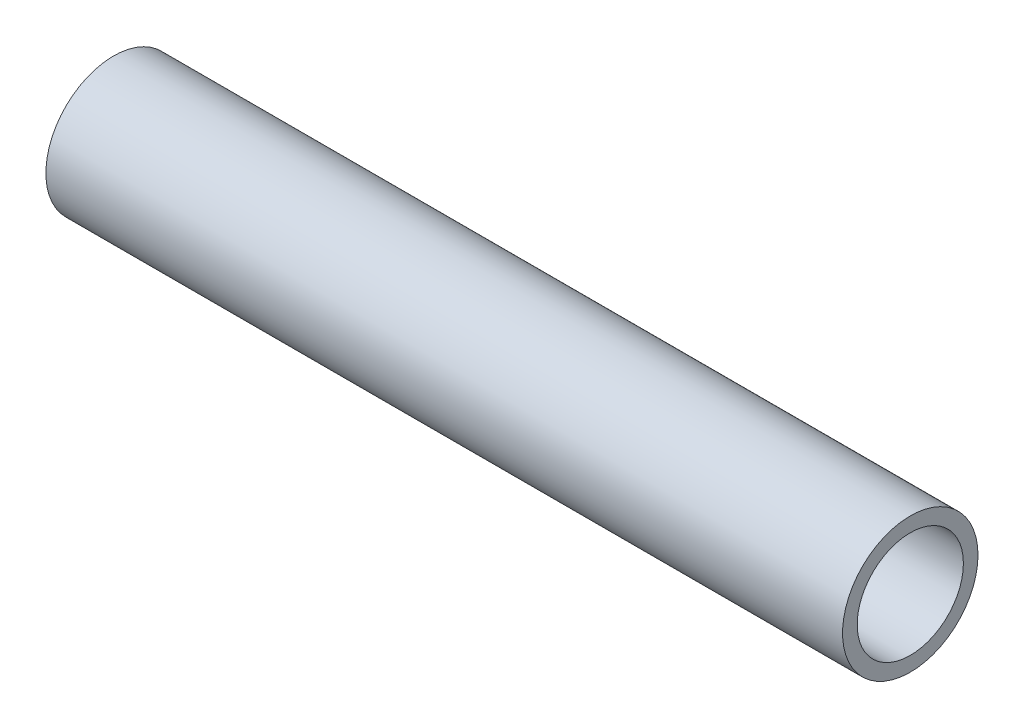
ISO-10303-21;
HEADER;
FILE_DESCRIPTION(('STEP AP214'),'2;1');
FILE_NAME('part.step','',(''),(''),'','','');
FILE_SCHEMA(('AUTOMOTIVE_DESIGN { 1 0 10303 214 1 1 1 1 }'));
ENDSEC;
DATA;
#1=APPLICATION_CONTEXT('core data for automotive mechanical design processes');
#2=APPLICATION_PROTOCOL_DEFINITION('international standard','automotive_design',2000,#1);
#3=PRODUCT_CONTEXT('',#1,'mechanical');
#4=PRODUCT('Part','Part','',(#3));
#5=PRODUCT_RELATED_PRODUCT_CATEGORY('part','',(#4));
#6=PRODUCT_DEFINITION_FORMATION('','',#4);
#7=PRODUCT_DEFINITION_CONTEXT('part definition',#1,'design');
#8=PRODUCT_DEFINITION('design','',#6,#7);
#9=PRODUCT_DEFINITION_SHAPE('','',#8);
#10=(LENGTH_UNIT() NAMED_UNIT(*) SI_UNIT(.MILLI.,.METRE.));
#11=(NAMED_UNIT(*) PLANE_ANGLE_UNIT() SI_UNIT($,.RADIAN.));
#12=(NAMED_UNIT(*) SI_UNIT($,.STERADIAN.) SOLID_ANGLE_UNIT());
#13=UNCERTAINTY_MEASURE_WITH_UNIT(LENGTH_MEASURE(1.E-05),#10,'distance_accuracy_value','');
#14=(GEOMETRIC_REPRESENTATION_CONTEXT(3) GLOBAL_UNCERTAINTY_ASSIGNED_CONTEXT((#13)) GLOBAL_UNIT_ASSIGNED_CONTEXT((#10,
#11,#12)) REPRESENTATION_CONTEXT('',''));
#15=CARTESIAN_POINT('',(0.,0.,0.));
#16=DIRECTION('',(0.,0.,1.));
#17=DIRECTION('',(1.,0.,0.));
#18=AXIS2_PLACEMENT_3D('',#15,#16,#17);
#19=CARTESIAN_POINT('',(60.,0.,0.));
#20=DIRECTION('',(1.,0.,0.));
#21=DIRECTION('',(0.,0.,-1.));
#22=AXIS2_PLACEMENT_3D('',#19,#20,#21);
#23=PLANE('',#22);
#24=CARTESIAN_POINT('',(60.,0.,0.));
#25=DIRECTION('',(1.,0.,0.));
#26=DIRECTION('',(0.,0.,-1.));
#27=AXIS2_PLACEMENT_3D('',#24,#25,#26);
#28=CIRCLE('',#27,5.1);
#29=CARTESIAN_POINT('',(60.,0.,-5.1));
#30=VERTEX_POINT('',#29);
#31=EDGE_CURVE('E10',#30,#30,#28,.T.);
#32=ORIENTED_EDGE('',*,*,#31,.T.);
#33=EDGE_LOOP('',(#32));
#34=FACE_BOUND('',#33,.T.);
#35=CARTESIAN_POINT('',(60.,0.,0.));
#36=DIRECTION('',(1.,0.,0.));
#37=DIRECTION('',(0.,0.,-1.));
#38=AXIS2_PLACEMENT_3D('',#35,#36,#37);
#39=CIRCLE('',#38,4.);
#40=CARTESIAN_POINT('',(60.,0.,-4.));
#41=VERTEX_POINT('',#40);
#42=EDGE_CURVE('E44',#41,#41,#39,.T.);
#43=ORIENTED_EDGE('',*,*,#42,.F.);
#44=EDGE_LOOP('',(#43));
#45=FACE_BOUND('',#44,.T.);
#46=ADVANCED_FACE('F33',(#34,#45),#23,.T.);
#47=CARTESIAN_POINT('',(0.,0.,0.));
#48=DIRECTION('',(1.,0.,0.));
#49=DIRECTION('',(0.,0.,-1.));
#50=AXIS2_PLACEMENT_3D('',#47,#48,#49);
#51=PLANE('',#50);
#52=CARTESIAN_POINT('',(0.,0.,0.));
#53=DIRECTION('',(1.,0.,0.));
#54=DIRECTION('',(0.,0.,-1.));
#55=AXIS2_PLACEMENT_3D('',#52,#53,#54);
#56=CIRCLE('',#55,5.1);
#57=CARTESIAN_POINT('',(0.,0.,-5.1));
#58=VERTEX_POINT('',#57);
#59=EDGE_CURVE('E37',#58,#58,#56,.T.);
#60=ORIENTED_EDGE('',*,*,#59,.F.);
#61=EDGE_LOOP('',(#60));
#62=FACE_BOUND('',#61,.T.);
#63=CARTESIAN_POINT('',(0.,0.,0.));
#64=DIRECTION('',(1.,0.,0.));
#65=DIRECTION('',(0.,0.,-1.));
#66=AXIS2_PLACEMENT_3D('',#63,#64,#65);
#67=CIRCLE('',#66,4.);
#68=CARTESIAN_POINT('',(0.,0.,-4.));
#69=VERTEX_POINT('',#68);
#70=EDGE_CURVE('E46',#69,#69,#67,.T.);
#71=ORIENTED_EDGE('',*,*,#70,.T.);
#72=EDGE_LOOP('',(#71));
#73=FACE_BOUND('',#72,.T.);
#74=ADVANCED_FACE('F56',(#62,#73),#51,.F.);
#75=CARTESIAN_POINT('',(60.,0.,0.));
#76=DIRECTION('',(-1.,0.,0.));
#77=DIRECTION('',(0.,0.,1.));
#78=AXIS2_PLACEMENT_3D('',#75,#76,#77);
#79=CYLINDRICAL_SURFACE('',#78,5.1);
#80=ORIENTED_EDGE('',*,*,#31,.F.);
#81=EDGE_LOOP('',(#80));
#82=FACE_BOUND('',#81,.T.);
#83=ORIENTED_EDGE('',*,*,#59,.T.);
#84=EDGE_LOOP('',(#83));
#85=FACE_BOUND('',#84,.T.);
#86=ADVANCED_FACE('F35',(#82,#85),#79,.T.);
#87=CARTESIAN_POINT('',(60.,0.,0.));
#88=DIRECTION('',(-1.,0.,0.));
#89=DIRECTION('',(0.,0.,1.));
#90=AXIS2_PLACEMENT_3D('',#87,#88,#89);
#91=CYLINDRICAL_SURFACE('',#90,4.);
#92=ORIENTED_EDGE('',*,*,#42,.T.);
#93=EDGE_LOOP('',(#92));
#94=FACE_BOUND('',#93,.T.);
#95=ORIENTED_EDGE('',*,*,#70,.F.);
#96=EDGE_LOOP('',(#95));
#97=FACE_BOUND('',#96,.T.);
#98=ADVANCED_FACE('F52',(#94,#97),#91,.F.);
#99=CLOSED_SHELL('',(#46,#74,#86,#98));
#100=MANIFOLD_SOLID_BREP('B2',#99);
#101=ADVANCED_BREP_SHAPE_REPRESENTATION('',(#18,#100),#14);
#102=SHAPE_DEFINITION_REPRESENTATION(#9,#101);
ENDSEC;
END-ISO-10303-21;
